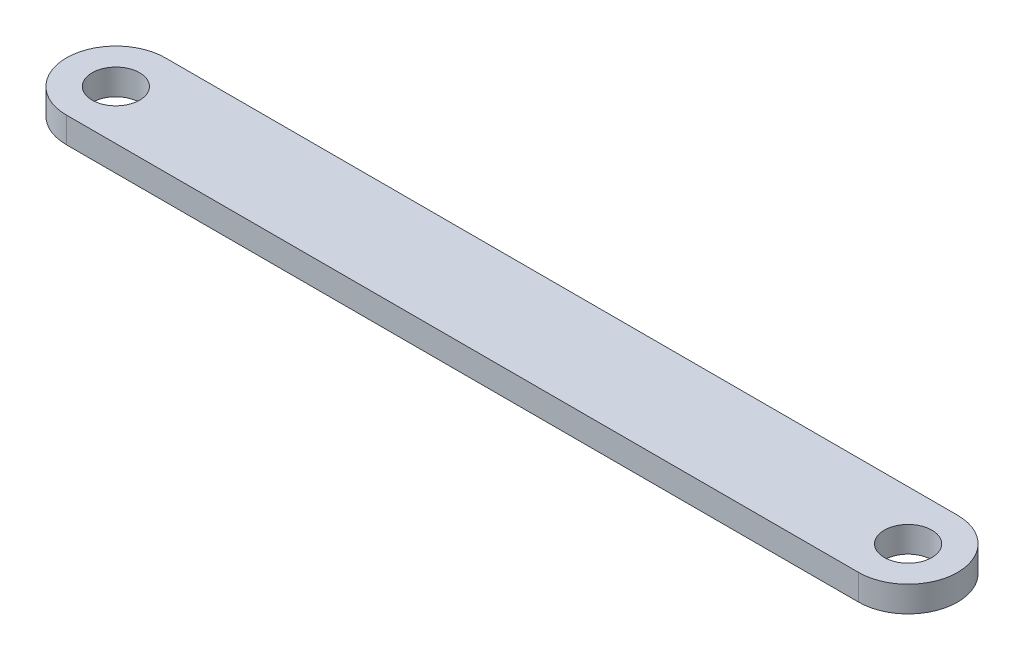
ISO-10303-21;
HEADER;
FILE_DESCRIPTION(('STEP AP214'),'2;1');
FILE_NAME('part.step','',(''),(''),'','','');
FILE_SCHEMA(('AUTOMOTIVE_DESIGN { 1 0 10303 214 1 1 1 1 }'));
ENDSEC;
DATA;
#1=APPLICATION_CONTEXT('core data for automotive mechanical design processes');
#2=APPLICATION_PROTOCOL_DEFINITION('international standard','automotive_design',2000,#1);
#3=PRODUCT_CONTEXT('',#1,'mechanical');
#4=PRODUCT('Part','Part','',(#3));
#5=PRODUCT_RELATED_PRODUCT_CATEGORY('part','',(#4));
#6=PRODUCT_DEFINITION_FORMATION('','',#4);
#7=PRODUCT_DEFINITION_CONTEXT('part definition',#1,'design');
#8=PRODUCT_DEFINITION('design','',#6,#7);
#9=PRODUCT_DEFINITION_SHAPE('','',#8);
#10=(LENGTH_UNIT() NAMED_UNIT(*) SI_UNIT(.MILLI.,.METRE.));
#11=(NAMED_UNIT(*) PLANE_ANGLE_UNIT() SI_UNIT($,.RADIAN.));
#12=(NAMED_UNIT(*) SI_UNIT($,.STERADIAN.) SOLID_ANGLE_UNIT());
#13=UNCERTAINTY_MEASURE_WITH_UNIT(LENGTH_MEASURE(1.E-05),#10,'distance_accuracy_value','');
#14=(GEOMETRIC_REPRESENTATION_CONTEXT(3) GLOBAL_UNCERTAINTY_ASSIGNED_CONTEXT((#13)) GLOBAL_UNIT_ASSIGNED_CONTEXT((#10,
#11,#12)) REPRESENTATION_CONTEXT('',''));
#15=CARTESIAN_POINT('',(0.,0.,0.));
#16=DIRECTION('',(0.,0.,1.));
#17=DIRECTION('',(1.,0.,0.));
#18=AXIS2_PLACEMENT_3D('',#15,#16,#17);
#19=CARTESIAN_POINT('',(100.,6.5,0.));
#20=DIRECTION('',(0.,1.,0.));
#21=DIRECTION('',(0.,0.,1.));
#22=AXIS2_PLACEMENT_3D('',#19,#20,#21);
#23=PLANE('',#22);
#24=CARTESIAN_POINT('',(-100.,6.5,0.));
#25=DIRECTION('',(0.,1.,0.));
#26=DIRECTION('',(0.,0.,1.));
#27=AXIS2_PLACEMENT_3D('',#24,#25,#26);
#28=CIRCLE('',#27,6.);
#29=CARTESIAN_POINT('',(-100.,6.5,-6.));
#30=VERTEX_POINT('',#29);
#31=EDGE_CURVE('E100',#30,#30,#28,.T.);
#32=ORIENTED_EDGE('',*,*,#31,.F.);
#33=EDGE_LOOP('',(#32));
#34=FACE_BOUND('',#33,.T.);
#35=CARTESIAN_POINT('',(100.,6.5,0.));
#36=DIRECTION('',(0.,1.,0.));
#37=DIRECTION('',(0.,0.,1.));
#38=AXIS2_PLACEMENT_3D('',#35,#36,#37);
#39=CIRCLE('',#38,12.5);
#40=CARTESIAN_POINT('',(100.,6.5,12.5));
#41=VERTEX_POINT('',#40);
#42=CARTESIAN_POINT('',(100.,6.5,-12.5));
#43=VERTEX_POINT('',#42);
#44=EDGE_CURVE('E85',#41,#43,#39,.T.);
#45=ORIENTED_EDGE('',*,*,#44,.T.);
#46=DIRECTION('',(-1.,0.,0.));
#47=VECTOR('',#46,1.);
#48=CARTESIAN_POINT('',(100.,6.5,-12.5));
#49=LINE('',#48,#47);
#50=CARTESIAN_POINT('',(-100.,6.5,-12.5));
#51=VERTEX_POINT('',#50);
#52=EDGE_CURVE('E80',#43,#51,#49,.T.);
#53=ORIENTED_EDGE('',*,*,#52,.T.);
#54=CARTESIAN_POINT('',(-100.,6.5,0.));
#55=DIRECTION('',(0.,1.,0.));
#56=DIRECTION('',(0.,0.,1.));
#57=AXIS2_PLACEMENT_3D('',#54,#55,#56);
#58=CIRCLE('',#57,12.5);
#59=CARTESIAN_POINT('',(-100.,6.5,12.5));
#60=VERTEX_POINT('',#59);
#61=EDGE_CURVE('E83',#51,#60,#58,.T.);
#62=ORIENTED_EDGE('',*,*,#61,.T.);
#63=DIRECTION('',(1.,0.,0.));
#64=VECTOR('',#63,1.);
#65=CARTESIAN_POINT('',(100.,6.5,12.5));
#66=LINE('',#65,#64);
#67=EDGE_CURVE('E50',#60,#41,#66,.T.);
#68=ORIENTED_EDGE('',*,*,#67,.T.);
#69=EDGE_LOOP('',(#45,#53,#62,#68));
#70=FACE_BOUND('',#69,.T.);
#71=CARTESIAN_POINT('',(100.,6.5,0.));
#72=DIRECTION('',(0.,1.,0.));
#73=DIRECTION('',(0.,0.,1.));
#74=AXIS2_PLACEMENT_3D('',#71,#72,#73);
#75=CIRCLE('',#74,6.);
#76=CARTESIAN_POINT('',(100.,6.5,-6.));
#77=VERTEX_POINT('',#76);
#78=EDGE_CURVE('E115',#77,#77,#75,.T.);
#79=ORIENTED_EDGE('',*,*,#78,.F.);
#80=EDGE_LOOP('',(#79));
#81=FACE_BOUND('',#80,.T.);
#82=ADVANCED_FACE('F33',(#34,#70,#81),#23,.T.);
#83=CARTESIAN_POINT('',(100.,0.,0.));
#84=DIRECTION('',(0.,1.,0.));
#85=DIRECTION('',(0.,0.,1.));
#86=AXIS2_PLACEMENT_3D('',#83,#84,#85);
#87=PLANE('',#86);
#88=CARTESIAN_POINT('',(100.,0.,0.));
#89=DIRECTION('',(0.,1.,0.));
#90=DIRECTION('',(0.,0.,1.));
#91=AXIS2_PLACEMENT_3D('',#88,#89,#90);
#92=CIRCLE('',#91,12.5);
#93=CARTESIAN_POINT('',(100.,0.,12.5));
#94=VERTEX_POINT('',#93);
#95=CARTESIAN_POINT('',(100.,0.,-12.5));
#96=VERTEX_POINT('',#95);
#97=EDGE_CURVE('E97',#94,#96,#92,.T.);
#98=ORIENTED_EDGE('',*,*,#97,.F.);
#99=DIRECTION('',(1.,0.,0.));
#100=VECTOR('',#99,1.);
#101=CARTESIAN_POINT('',(100.,0.,12.5));
#102=LINE('',#101,#100);
#103=CARTESIAN_POINT('',(-100.,0.,12.5));
#104=VERTEX_POINT('',#103);
#105=EDGE_CURVE('E73',#104,#94,#102,.T.);
#106=ORIENTED_EDGE('',*,*,#105,.F.);
#107=CARTESIAN_POINT('',(-100.,0.,0.));
#108=DIRECTION('',(0.,1.,0.));
#109=DIRECTION('',(0.,0.,1.));
#110=AXIS2_PLACEMENT_3D('',#107,#108,#109);
#111=CIRCLE('',#110,12.5);
#112=CARTESIAN_POINT('',(-100.,0.,-12.5));
#113=VERTEX_POINT('',#112);
#114=EDGE_CURVE('E67',#113,#104,#111,.T.);
#115=ORIENTED_EDGE('',*,*,#114,.F.);
#116=DIRECTION('',(-1.,0.,0.));
#117=VECTOR('',#116,1.);
#118=CARTESIAN_POINT('',(100.,0.,-12.5));
#119=LINE('',#118,#117);
#120=EDGE_CURVE('E89',#96,#113,#119,.T.);
#121=ORIENTED_EDGE('',*,*,#120,.F.);
#122=EDGE_LOOP('',(#98,#106,#115,#121));
#123=FACE_BOUND('',#122,.T.);
#124=CARTESIAN_POINT('',(-100.,0.,0.));
#125=DIRECTION('',(0.,1.,0.));
#126=DIRECTION('',(0.,0.,1.));
#127=AXIS2_PLACEMENT_3D('',#124,#125,#126);
#128=CIRCLE('',#127,6.);
#129=CARTESIAN_POINT('',(-100.,0.,-6.));
#130=VERTEX_POINT('',#129);
#131=EDGE_CURVE('E112',#130,#130,#128,.T.);
#132=ORIENTED_EDGE('',*,*,#131,.T.);
#133=EDGE_LOOP('',(#132));
#134=FACE_BOUND('',#133,.T.);
#135=CARTESIAN_POINT('',(100.,0.,0.));
#136=DIRECTION('',(0.,1.,0.));
#137=DIRECTION('',(0.,0.,1.));
#138=AXIS2_PLACEMENT_3D('',#135,#136,#137);
#139=CIRCLE('',#138,6.);
#140=CARTESIAN_POINT('',(100.,0.,-6.));
#141=VERTEX_POINT('',#140);
#142=EDGE_CURVE('E118',#141,#141,#139,.T.);
#143=ORIENTED_EDGE('',*,*,#142,.T.);
#144=EDGE_LOOP('',(#143));
#145=FACE_BOUND('',#144,.T.);
#146=ADVANCED_FACE('F108',(#123,#134,#145),#87,.F.);
#147=CARTESIAN_POINT('',(100.,6.5,0.));
#148=DIRECTION('',(0.,-1.,0.));
#149=DIRECTION('',(0.,0.,-1.));
#150=AXIS2_PLACEMENT_3D('',#147,#148,#149);
#151=CYLINDRICAL_SURFACE('',#150,12.5);
#152=ORIENTED_EDGE('',*,*,#97,.T.);
#153=DIRECTION('',(0.,-1.,0.));
#154=VECTOR('',#153,1.);
#155=CARTESIAN_POINT('',(100.,6.5,-12.5));
#156=LINE('',#155,#154);
#157=EDGE_CURVE('E11',#43,#96,#156,.T.);
#158=ORIENTED_EDGE('',*,*,#157,.F.);
#159=ORIENTED_EDGE('',*,*,#44,.F.);
#160=DIRECTION('',(0.,-1.,0.));
#161=VECTOR('',#160,1.);
#162=CARTESIAN_POINT('',(100.,6.5,12.5));
#163=LINE('',#162,#161);
#164=EDGE_CURVE('E93',#41,#94,#163,.T.);
#165=ORIENTED_EDGE('',*,*,#164,.T.);
#166=EDGE_LOOP('',(#152,#158,#159,#165));
#167=FACE_BOUND('',#166,.T.);
#168=ADVANCED_FACE('F35',(#167),#151,.T.);
#169=CARTESIAN_POINT('',(100.,6.5,-12.5));
#170=DIRECTION('',(0.,0.,1.));
#171=DIRECTION('',(1.,0.,0.));
#172=AXIS2_PLACEMENT_3D('',#169,#170,#171);
#173=PLANE('',#172);
#174=ORIENTED_EDGE('',*,*,#120,.T.);
#175=DIRECTION('',(0.,-1.,0.));
#176=VECTOR('',#175,1.);
#177=CARTESIAN_POINT('',(-100.,6.5,-12.5));
#178=LINE('',#177,#176);
#179=EDGE_CURVE('E42',#51,#113,#178,.T.);
#180=ORIENTED_EDGE('',*,*,#179,.F.);
#181=ORIENTED_EDGE('',*,*,#52,.F.);
#182=ORIENTED_EDGE('',*,*,#157,.T.);
#183=EDGE_LOOP('',(#174,#180,#181,#182));
#184=FACE_BOUND('',#183,.T.);
#185=ADVANCED_FACE('F88',(#184),#173,.F.);
#186=CARTESIAN_POINT('',(-100.,6.5,0.));
#187=DIRECTION('',(0.,-1.,0.));
#188=DIRECTION('',(0.,0.,-1.));
#189=AXIS2_PLACEMENT_3D('',#186,#187,#188);
#190=CYLINDRICAL_SURFACE('',#189,12.5);
#191=ORIENTED_EDGE('',*,*,#114,.T.);
#192=DIRECTION('',(0.,-1.,0.));
#193=VECTOR('',#192,1.);
#194=CARTESIAN_POINT('',(-100.,6.5,12.5));
#195=LINE('',#194,#193);
#196=EDGE_CURVE('E90',#60,#104,#195,.T.);
#197=ORIENTED_EDGE('',*,*,#196,.F.);
#198=ORIENTED_EDGE('',*,*,#61,.F.);
#199=ORIENTED_EDGE('',*,*,#179,.T.);
#200=EDGE_LOOP('',(#191,#197,#198,#199));
#201=FACE_BOUND('',#200,.T.);
#202=ADVANCED_FACE('F91',(#201),#190,.T.);
#203=CARTESIAN_POINT('',(100.,6.5,12.5));
#204=DIRECTION('',(0.,0.,-1.));
#205=DIRECTION('',(-1.,0.,0.));
#206=AXIS2_PLACEMENT_3D('',#203,#204,#205);
#207=PLANE('',#206);
#208=ORIENTED_EDGE('',*,*,#105,.T.);
#209=ORIENTED_EDGE('',*,*,#164,.F.);
#210=ORIENTED_EDGE('',*,*,#67,.F.);
#211=ORIENTED_EDGE('',*,*,#196,.T.);
#212=EDGE_LOOP('',(#208,#209,#210,#211));
#213=FACE_BOUND('',#212,.T.);
#214=ADVANCED_FACE('F105',(#213),#207,.F.);
#215=CARTESIAN_POINT('',(-100.,6.5,0.));
#216=DIRECTION('',(0.,-1.,0.));
#217=DIRECTION('',(0.,0.,-1.));
#218=AXIS2_PLACEMENT_3D('',#215,#216,#217);
#219=CYLINDRICAL_SURFACE('',#218,6.);
#220=CARTESIAN_POINT('',(-100.,6.5,-6.));
#221=CARTESIAN_POINT('',(-100.,6.43229166666667,-6.));
#222=CARTESIAN_POINT('',(-100.,6.36458333333333,-6.));
#223=CARTESIAN_POINT('',(-100.,6.22916666666667,-6.));
#224=CARTESIAN_POINT('',(-100.,6.16145833333333,-6.));
#225=CARTESIAN_POINT('',(-100.,6.02604166666667,-6.));
#226=CARTESIAN_POINT('',(-100.,5.95833333333333,-6.));
#227=CARTESIAN_POINT('',(-100.,5.82291666666667,-6.));
#228=CARTESIAN_POINT('',(-100.,5.75520833333333,-6.));
#229=CARTESIAN_POINT('',(-100.,5.61979166666667,-6.));
#230=CARTESIAN_POINT('',(-100.,5.55208333333333,-6.));
#231=CARTESIAN_POINT('',(-100.,5.41666666666667,-6.));
#232=CARTESIAN_POINT('',(-100.,5.34895833333333,-6.));
#233=CARTESIAN_POINT('',(-100.,5.21354166666667,-6.));
#234=CARTESIAN_POINT('',(-100.,5.14583333333333,-6.));
#235=CARTESIAN_POINT('',(-100.,5.01041666666667,-6.));
#236=CARTESIAN_POINT('',(-100.,4.94270833333333,-6.));
#237=CARTESIAN_POINT('',(-100.,4.80729166666667,-6.));
#238=CARTESIAN_POINT('',(-100.,4.73958333333333,-6.));
#239=CARTESIAN_POINT('',(-100.,4.60416666666667,-6.));
#240=CARTESIAN_POINT('',(-100.,4.53645833333333,-6.));
#241=CARTESIAN_POINT('',(-100.,4.40104166666667,-6.));
#242=CARTESIAN_POINT('',(-100.,4.33333333333333,-6.));
#243=CARTESIAN_POINT('',(-100.,4.19791666666667,-6.));
#244=CARTESIAN_POINT('',(-100.,4.13020833333333,-6.));
#245=CARTESIAN_POINT('',(-100.,3.99479166666667,-6.));
#246=CARTESIAN_POINT('',(-100.,3.92708333333333,-6.));
#247=CARTESIAN_POINT('',(-100.,3.79166666666667,-6.));
#248=CARTESIAN_POINT('',(-100.,3.72395833333333,-6.));
#249=CARTESIAN_POINT('',(-100.,3.58854166666667,-6.));
#250=CARTESIAN_POINT('',(-100.,3.52083333333333,-6.));
#251=CARTESIAN_POINT('',(-100.,3.38541666666667,-6.));
#252=CARTESIAN_POINT('',(-100.,3.31770833333333,-6.));
#253=CARTESIAN_POINT('',(-100.,3.18229166666667,-6.));
#254=CARTESIAN_POINT('',(-100.,3.11458333333333,-6.));
#255=CARTESIAN_POINT('',(-100.,2.97916666666667,-6.));
#256=CARTESIAN_POINT('',(-100.,2.91145833333333,-6.));
#257=CARTESIAN_POINT('',(-100.,2.77604166666667,-6.));
#258=CARTESIAN_POINT('',(-100.,2.70833333333333,-6.));
#259=CARTESIAN_POINT('',(-100.,2.57291666666667,-6.));
#260=CARTESIAN_POINT('',(-100.,2.50520833333333,-6.));
#261=CARTESIAN_POINT('',(-100.,2.36979166666667,-6.));
#262=CARTESIAN_POINT('',(-100.,2.30208333333333,-6.));
#263=CARTESIAN_POINT('',(-100.,2.16666666666667,-6.));
#264=CARTESIAN_POINT('',(-100.,2.09895833333333,-6.));
#265=CARTESIAN_POINT('',(-100.,1.96354166666667,-6.));
#266=CARTESIAN_POINT('',(-100.,1.89583333333333,-6.));
#267=CARTESIAN_POINT('',(-100.,1.76041666666667,-6.));
#268=CARTESIAN_POINT('',(-100.,1.69270833333333,-6.));
#269=CARTESIAN_POINT('',(-100.,1.55729166666667,-6.));
#270=CARTESIAN_POINT('',(-100.,1.48958333333333,-6.));
#271=CARTESIAN_POINT('',(-100.,1.35416666666667,-6.));
#272=CARTESIAN_POINT('',(-100.,1.28645833333333,-6.));
#273=CARTESIAN_POINT('',(-100.,1.15104166666667,-6.));
#274=CARTESIAN_POINT('',(-100.,1.08333333333333,-6.));
#275=CARTESIAN_POINT('',(-100.,0.947916666666667,-6.));
#276=CARTESIAN_POINT('',(-100.,0.880208333333333,-6.));
#277=CARTESIAN_POINT('',(-100.,0.744791666666667,-6.));
#278=CARTESIAN_POINT('',(-100.,0.677083333333333,-6.));
#279=CARTESIAN_POINT('',(-100.,0.541666666666667,-6.));
#280=CARTESIAN_POINT('',(-100.,0.473958333333333,-6.));
#281=CARTESIAN_POINT('',(-100.,0.338541666666667,-6.));
#282=CARTESIAN_POINT('',(-100.,0.270833333333334,-6.));
#283=CARTESIAN_POINT('',(-100.,0.135416666666667,-6.));
#284=CARTESIAN_POINT('',(-100.,0.0677083333333334,-6.));
#285=CARTESIAN_POINT('',(-100.,0.,-6.));
#286=B_SPLINE_CURVE_WITH_KNOTS('',3,(#220,#221,#222,#223,#224,#225,#226,#227,#228,#229,#230,
#231,#232,#233,#234,#235,#236,#237,#238,#239,#240,#241,#242,#243,#244,#245,#246,#247,#248,#249,
#250,#251,#252,#253,#254,#255,#256,#257,#258,#259,#260,#261,#262,#263,#264,#265,#266,#267,#268,
#269,#270,#271,#272,#273,#274,#275,#276,#277,#278,#279,#280,#281,#282,#283,#284,#285),
.UNSPECIFIED.,.F.,.F.,(4,2,2,2,2,2,2,2,2,2,2,2,2,2,2,2,2,2,2,2,2,2,2,2,2,2,2,2,2,2,2,2,4),(0.,
0.203125,0.40625,0.609375000000001,0.812500000000001,1.015625,1.21875,1.421875,1.625,1.828125,
2.03125,2.234375,2.4375,2.640625,2.84375,3.046875,3.25,3.453125,3.65625,3.859375,4.0625,
4.265625,4.46875,4.671875,4.875,5.078125,5.28125,5.484375,5.6875,5.890625,6.09375,6.296875,6.5),.UNSPECIFIED.);
#287=EDGE_CURVE('BSEAM135',#30,#130,#286,.T.);
#288=ORIENTED_EDGE('',*,*,#31,.T.);
#289=ORIENTED_EDGE('',*,*,#131,.F.);
#290=ORIENTED_EDGE('',*,*,#287,.T.);
#291=ORIENTED_EDGE('',*,*,#287,.F.);
#292=EDGE_LOOP('',(#288,#290,#289,#291));
#293=FACE_BOUND('',#292,.T.);
#294=ADVANCED_FACE('F135',(#293),#219,.F.);
#295=CARTESIAN_POINT('',(100.,6.5,0.));
#296=DIRECTION('',(0.,-1.,0.));
#297=DIRECTION('',(0.,0.,-1.));
#298=AXIS2_PLACEMENT_3D('',#295,#296,#297);
#299=CYLINDRICAL_SURFACE('',#298,6.);
#300=CARTESIAN_POINT('',(100.,6.5,-6.));
#301=CARTESIAN_POINT('',(100.,6.43229166666667,-6.));
#302=CARTESIAN_POINT('',(100.,6.36458333333333,-6.));
#303=CARTESIAN_POINT('',(100.,6.22916666666667,-6.));
#304=CARTESIAN_POINT('',(100.,6.16145833333333,-6.));
#305=CARTESIAN_POINT('',(100.,6.02604166666667,-6.));
#306=CARTESIAN_POINT('',(100.,5.95833333333333,-6.));
#307=CARTESIAN_POINT('',(100.,5.82291666666667,-6.));
#308=CARTESIAN_POINT('',(100.,5.75520833333333,-6.));
#309=CARTESIAN_POINT('',(100.,5.61979166666667,-6.));
#310=CARTESIAN_POINT('',(100.,5.55208333333333,-6.));
#311=CARTESIAN_POINT('',(100.,5.41666666666667,-6.));
#312=CARTESIAN_POINT('',(100.,5.34895833333333,-6.));
#313=CARTESIAN_POINT('',(100.,5.21354166666667,-6.));
#314=CARTESIAN_POINT('',(100.,5.14583333333333,-6.));
#315=CARTESIAN_POINT('',(100.,5.01041666666667,-6.));
#316=CARTESIAN_POINT('',(100.,4.94270833333333,-6.));
#317=CARTESIAN_POINT('',(100.,4.80729166666667,-6.));
#318=CARTESIAN_POINT('',(100.,4.73958333333333,-6.));
#319=CARTESIAN_POINT('',(100.,4.60416666666667,-6.));
#320=CARTESIAN_POINT('',(100.,4.53645833333333,-6.));
#321=CARTESIAN_POINT('',(100.,4.40104166666667,-6.));
#322=CARTESIAN_POINT('',(100.,4.33333333333333,-6.));
#323=CARTESIAN_POINT('',(100.,4.19791666666667,-6.));
#324=CARTESIAN_POINT('',(100.,4.13020833333333,-6.));
#325=CARTESIAN_POINT('',(100.,3.99479166666667,-6.));
#326=CARTESIAN_POINT('',(100.,3.92708333333333,-6.));
#327=CARTESIAN_POINT('',(100.,3.79166666666667,-6.));
#328=CARTESIAN_POINT('',(100.,3.72395833333333,-6.));
#329=CARTESIAN_POINT('',(100.,3.58854166666667,-6.));
#330=CARTESIAN_POINT('',(100.,3.52083333333333,-6.));
#331=CARTESIAN_POINT('',(100.,3.38541666666667,-6.));
#332=CARTESIAN_POINT('',(100.,3.31770833333333,-6.));
#333=CARTESIAN_POINT('',(100.,3.18229166666667,-6.));
#334=CARTESIAN_POINT('',(100.,3.11458333333333,-6.));
#335=CARTESIAN_POINT('',(100.,2.97916666666667,-6.));
#336=CARTESIAN_POINT('',(100.,2.91145833333333,-6.));
#337=CARTESIAN_POINT('',(100.,2.77604166666667,-6.));
#338=CARTESIAN_POINT('',(100.,2.70833333333333,-6.));
#339=CARTESIAN_POINT('',(100.,2.57291666666667,-6.));
#340=CARTESIAN_POINT('',(100.,2.50520833333333,-6.));
#341=CARTESIAN_POINT('',(100.,2.36979166666667,-6.));
#342=CARTESIAN_POINT('',(100.,2.30208333333333,-6.));
#343=CARTESIAN_POINT('',(100.,2.16666666666667,-6.));
#344=CARTESIAN_POINT('',(100.,2.09895833333333,-6.));
#345=CARTESIAN_POINT('',(100.,1.96354166666667,-6.));
#346=CARTESIAN_POINT('',(100.,1.89583333333333,-6.));
#347=CARTESIAN_POINT('',(100.,1.76041666666667,-6.));
#348=CARTESIAN_POINT('',(100.,1.69270833333333,-6.));
#349=CARTESIAN_POINT('',(100.,1.55729166666667,-6.));
#350=CARTESIAN_POINT('',(100.,1.48958333333333,-6.));
#351=CARTESIAN_POINT('',(100.,1.35416666666667,-6.));
#352=CARTESIAN_POINT('',(100.,1.28645833333333,-6.));
#353=CARTESIAN_POINT('',(100.,1.15104166666667,-6.));
#354=CARTESIAN_POINT('',(100.,1.08333333333333,-6.));
#355=CARTESIAN_POINT('',(100.,0.947916666666667,-6.));
#356=CARTESIAN_POINT('',(100.,0.880208333333333,-6.));
#357=CARTESIAN_POINT('',(100.,0.744791666666667,-6.));
#358=CARTESIAN_POINT('',(100.,0.677083333333333,-6.));
#359=CARTESIAN_POINT('',(100.,0.541666666666667,-6.));
#360=CARTESIAN_POINT('',(100.,0.473958333333333,-6.));
#361=CARTESIAN_POINT('',(100.,0.338541666666667,-6.));
#362=CARTESIAN_POINT('',(100.,0.270833333333334,-6.));
#363=CARTESIAN_POINT('',(100.,0.135416666666667,-6.));
#364=CARTESIAN_POINT('',(100.,0.0677083333333334,-6.));
#365=CARTESIAN_POINT('',(100.,0.,-6.));
#366=B_SPLINE_CURVE_WITH_KNOTS('',3,(#300,#301,#302,#303,#304,#305,#306,#307,#308,#309,#310,
#311,#312,#313,#314,#315,#316,#317,#318,#319,#320,#321,#322,#323,#324,#325,#326,#327,#328,#329,
#330,#331,#332,#333,#334,#335,#336,#337,#338,#339,#340,#341,#342,#343,#344,#345,#346,#347,#348,
#349,#350,#351,#352,#353,#354,#355,#356,#357,#358,#359,#360,#361,#362,#363,#364,#365),
.UNSPECIFIED.,.F.,.F.,(4,2,2,2,2,2,2,2,2,2,2,2,2,2,2,2,2,2,2,2,2,2,2,2,2,2,2,2,2,2,2,2,4),(0.,
0.203125,0.40625,0.609375000000001,0.812500000000001,1.015625,1.21875,1.421875,1.625,1.828125,
2.03125,2.234375,2.4375,2.640625,2.84375,3.046875,3.25,3.453125,3.65625,3.859375,4.0625,
4.265625,4.46875,4.671875,4.875,5.078125,5.28125,5.484375,5.6875,5.890625,6.09375,6.296875,6.5),.UNSPECIFIED.);
#367=EDGE_CURVE('BSEAM124',#77,#141,#366,.T.);
#368=ORIENTED_EDGE('',*,*,#78,.T.);
#369=ORIENTED_EDGE('',*,*,#142,.F.);
#370=ORIENTED_EDGE('',*,*,#367,.T.);
#371=ORIENTED_EDGE('',*,*,#367,.F.);
#372=EDGE_LOOP('',(#368,#370,#369,#371));
#373=FACE_BOUND('',#372,.T.);
#374=ADVANCED_FACE('F124',(#373),#299,.F.);
#375=CLOSED_SHELL('',(#82,#146,#168,#185,#202,#214,#294,#374));
#376=MANIFOLD_SOLID_BREP('B2',#375);
#377=ADVANCED_BREP_SHAPE_REPRESENTATION('',(#18,#376),#14);
#378=SHAPE_DEFINITION_REPRESENTATION(#9,#377);
ENDSEC;
END-ISO-10303-21;
